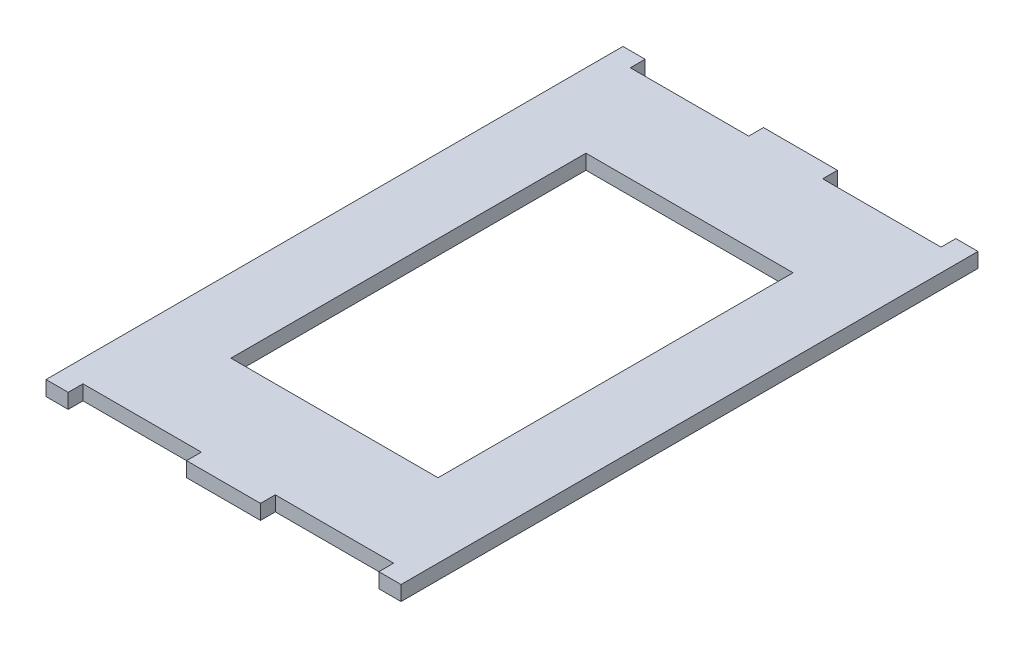
ISO-10303-21;
HEADER;
FILE_DESCRIPTION(('STEP AP214'),'2;1');
FILE_NAME('part.step','',(''),(''),'','','');
FILE_SCHEMA(('AUTOMOTIVE_DESIGN { 1 0 10303 214 1 1 1 1 }'));
ENDSEC;
DATA;
#1=APPLICATION_CONTEXT('core data for automotive mechanical design processes');
#2=APPLICATION_PROTOCOL_DEFINITION('international standard','automotive_design',2000,#1);
#3=PRODUCT_CONTEXT('',#1,'mechanical');
#4=PRODUCT('Part','Part','',(#3));
#5=PRODUCT_RELATED_PRODUCT_CATEGORY('part','',(#4));
#6=PRODUCT_DEFINITION_FORMATION('','',#4);
#7=PRODUCT_DEFINITION_CONTEXT('part definition',#1,'design');
#8=PRODUCT_DEFINITION('design','',#6,#7);
#9=PRODUCT_DEFINITION_SHAPE('','',#8);
#10=(LENGTH_UNIT() NAMED_UNIT(*) SI_UNIT(.MILLI.,.METRE.));
#11=(NAMED_UNIT(*) PLANE_ANGLE_UNIT() SI_UNIT($,.RADIAN.));
#12=(NAMED_UNIT(*) SI_UNIT($,.STERADIAN.) SOLID_ANGLE_UNIT());
#13=UNCERTAINTY_MEASURE_WITH_UNIT(LENGTH_MEASURE(1.E-05),#10,'distance_accuracy_value','');
#14=(GEOMETRIC_REPRESENTATION_CONTEXT(3) GLOBAL_UNCERTAINTY_ASSIGNED_CONTEXT((#13)) GLOBAL_UNIT_ASSIGNED_CONTEXT((#10,
#11,#12)) REPRESENTATION_CONTEXT('',''));
#15=CARTESIAN_POINT('',(0.,0.,0.));
#16=DIRECTION('',(0.,0.,1.));
#17=DIRECTION('',(1.,0.,0.));
#18=AXIS2_PLACEMENT_3D('',#15,#16,#17);
#19=CARTESIAN_POINT('',(0.,10.,0.));
#20=DIRECTION('',(0.,-1.,0.));
#21=DIRECTION('',(0.,0.,-1.));
#22=AXIS2_PLACEMENT_3D('',#19,#20,#21);
#23=PLANE('',#22);
#24=DIRECTION('',(0.,0.,1.));
#25=VECTOR('',#24,1.);
#26=CARTESIAN_POINT('',(0.,10.,-9.99999999999997));
#27=LINE('',#26,#25);
#28=CARTESIAN_POINT('',(0.,10.,-390.));
#29=VERTEX_POINT('',#28);
#30=CARTESIAN_POINT('',(0.,10.,0.));
#31=VERTEX_POINT('',#30);
#32=EDGE_CURVE('E230',#29,#31,#27,.T.);
#33=ORIENTED_EDGE('',*,*,#32,.T.);
#34=DIRECTION('',(1.,0.,0.));
#35=VECTOR('',#34,1.);
#36=CARTESIAN_POINT('',(15.,10.,0.));
#37=LINE('',#36,#35);
#38=CARTESIAN_POINT('',(15.,10.,0.));
#39=VERTEX_POINT('',#38);
#40=EDGE_CURVE('E233',#31,#39,#37,.T.);
#41=ORIENTED_EDGE('',*,*,#40,.T.);
#42=DIRECTION('',(0.,0.,-1.));
#43=VECTOR('',#42,1.);
#44=CARTESIAN_POINT('',(15.,10.,-10.));
#45=LINE('',#44,#43);
#46=CARTESIAN_POINT('',(15.,10.,-10.));
#47=VERTEX_POINT('',#46);
#48=EDGE_CURVE('E236',#39,#47,#45,.T.);
#49=ORIENTED_EDGE('',*,*,#48,.T.);
#50=DIRECTION('',(1.,0.,0.));
#51=VECTOR('',#50,1.);
#52=CARTESIAN_POINT('',(95.,10.,-10.));
#53=LINE('',#52,#51);
#54=CARTESIAN_POINT('',(95.,10.,-10.));
#55=VERTEX_POINT('',#54);
#56=EDGE_CURVE('E238',#47,#55,#53,.T.);
#57=ORIENTED_EDGE('',*,*,#56,.T.);
#58=DIRECTION('',(0.,0.,1.));
#59=VECTOR('',#58,1.);
#60=CARTESIAN_POINT('',(95.,10.,0.));
#61=LINE('',#60,#59);
#62=CARTESIAN_POINT('',(95.,10.,0.));
#63=VERTEX_POINT('',#62);
#64=EDGE_CURVE('E240',#55,#63,#61,.T.);
#65=ORIENTED_EDGE('',*,*,#64,.T.);
#66=DIRECTION('',(1.,0.,0.));
#67=VECTOR('',#66,1.);
#68=CARTESIAN_POINT('',(145.,10.,0.));
#69=LINE('',#68,#67);
#70=CARTESIAN_POINT('',(145.,10.,0.));
#71=VERTEX_POINT('',#70);
#72=EDGE_CURVE('E242',#63,#71,#69,.T.);
#73=ORIENTED_EDGE('',*,*,#72,.T.);
#74=DIRECTION('',(0.,0.,-1.));
#75=VECTOR('',#74,1.);
#76=CARTESIAN_POINT('',(145.,10.,-10.));
#77=LINE('',#76,#75);
#78=CARTESIAN_POINT('',(145.,10.,-10.));
#79=VERTEX_POINT('',#78);
#80=EDGE_CURVE('E244',#71,#79,#77,.T.);
#81=ORIENTED_EDGE('',*,*,#80,.T.);
#82=DIRECTION('',(1.,0.,0.));
#83=VECTOR('',#82,1.);
#84=CARTESIAN_POINT('',(225.,10.,-9.99999999999999));
#85=LINE('',#84,#83);
#86=CARTESIAN_POINT('',(225.,10.,-9.99999999999999));
#87=VERTEX_POINT('',#86);
#88=EDGE_CURVE('E246',#79,#87,#85,.T.);
#89=ORIENTED_EDGE('',*,*,#88,.T.);
#90=DIRECTION('',(0.,0.,1.));
#91=VECTOR('',#90,1.);
#92=CARTESIAN_POINT('',(225.,10.,0.));
#93=LINE('',#92,#91);
#94=CARTESIAN_POINT('',(225.,10.,0.));
#95=VERTEX_POINT('',#94);
#96=EDGE_CURVE('E248',#87,#95,#93,.T.);
#97=ORIENTED_EDGE('',*,*,#96,.T.);
#98=DIRECTION('',(1.,0.,0.));
#99=VECTOR('',#98,1.);
#100=CARTESIAN_POINT('',(240.,10.,0.));
#101=LINE('',#100,#99);
#102=CARTESIAN_POINT('',(240.,10.,0.));
#103=VERTEX_POINT('',#102);
#104=EDGE_CURVE('E250',#95,#103,#101,.T.);
#105=ORIENTED_EDGE('',*,*,#104,.T.);
#106=DIRECTION('',(0.,0.,-1.));
#107=VECTOR('',#106,1.);
#108=CARTESIAN_POINT('',(240.,10.,-9.99999999999994));
#109=LINE('',#108,#107);
#110=CARTESIAN_POINT('',(240.,10.,-390.));
#111=VERTEX_POINT('',#110);
#112=EDGE_CURVE('E252',#103,#111,#109,.T.);
#113=ORIENTED_EDGE('',*,*,#112,.T.);
#114=DIRECTION('',(-1.,0.,0.));
#115=VECTOR('',#114,1.);
#116=CARTESIAN_POINT('',(225.,10.,-390.));
#117=LINE('',#116,#115);
#118=CARTESIAN_POINT('',(225.,10.,-390.));
#119=VERTEX_POINT('',#118);
#120=EDGE_CURVE('E254',#111,#119,#117,.T.);
#121=ORIENTED_EDGE('',*,*,#120,.T.);
#122=DIRECTION('',(0.,0.,1.));
#123=VECTOR('',#122,1.);
#124=CARTESIAN_POINT('',(225.,10.,-390.));
#125=LINE('',#124,#123);
#126=CARTESIAN_POINT('',(225.,10.,-380.));
#127=VERTEX_POINT('',#126);
#128=EDGE_CURVE('E256',#119,#127,#125,.T.);
#129=ORIENTED_EDGE('',*,*,#128,.T.);
#130=DIRECTION('',(-1.,0.,0.));
#131=VECTOR('',#130,1.);
#132=CARTESIAN_POINT('',(145.,10.,-380.));
#133=LINE('',#132,#131);
#134=CARTESIAN_POINT('',(145.,10.,-380.));
#135=VERTEX_POINT('',#134);
#136=EDGE_CURVE('E258',#127,#135,#133,.T.);
#137=ORIENTED_EDGE('',*,*,#136,.T.);
#138=DIRECTION('',(0.,0.,-1.));
#139=VECTOR('',#138,1.);
#140=CARTESIAN_POINT('',(145.,10.,-380.));
#141=LINE('',#140,#139);
#142=CARTESIAN_POINT('',(145.,10.,-390.));
#143=VERTEX_POINT('',#142);
#144=EDGE_CURVE('E260',#135,#143,#141,.T.);
#145=ORIENTED_EDGE('',*,*,#144,.T.);
#146=DIRECTION('',(-1.,0.,0.));
#147=VECTOR('',#146,1.);
#148=CARTESIAN_POINT('',(94.9999999999999,10.,-390.));
#149=LINE('',#148,#147);
#150=CARTESIAN_POINT('',(94.9999999999999,10.,-390.));
#151=VERTEX_POINT('',#150);
#152=EDGE_CURVE('E262',#143,#151,#149,.T.);
#153=ORIENTED_EDGE('',*,*,#152,.T.);
#154=DIRECTION('',(0.,0.,1.));
#155=VECTOR('',#154,1.);
#156=CARTESIAN_POINT('',(94.9999999999999,10.,-390.));
#157=LINE('',#156,#155);
#158=CARTESIAN_POINT('',(94.9999999999999,10.,-380.));
#159=VERTEX_POINT('',#158);
#160=EDGE_CURVE('E264',#151,#159,#157,.T.);
#161=ORIENTED_EDGE('',*,*,#160,.T.);
#162=DIRECTION('',(-1.,0.,0.));
#163=VECTOR('',#162,1.);
#164=CARTESIAN_POINT('',(15.,10.,-380.));
#165=LINE('',#164,#163);
#166=CARTESIAN_POINT('',(15.,10.,-380.));
#167=VERTEX_POINT('',#166);
#168=EDGE_CURVE('E266',#159,#167,#165,.T.);
#169=ORIENTED_EDGE('',*,*,#168,.T.);
#170=DIRECTION('',(0.,0.,-1.));
#171=VECTOR('',#170,1.);
#172=CARTESIAN_POINT('',(15.,10.,-380.));
#173=LINE('',#172,#171);
#174=CARTESIAN_POINT('',(15.,10.,-390.));
#175=VERTEX_POINT('',#174);
#176=EDGE_CURVE('E268',#167,#175,#173,.T.);
#177=ORIENTED_EDGE('',*,*,#176,.T.);
#178=DIRECTION('',(-1.,0.,0.));
#179=VECTOR('',#178,1.);
#180=CARTESIAN_POINT('',(0.,10.,-390.));
#181=LINE('',#180,#179);
#182=EDGE_CURVE('E270',#175,#29,#181,.T.);
#183=ORIENTED_EDGE('',*,*,#182,.T.);
#184=EDGE_LOOP('',(#33,#41,#49,#57,#65,#73,#81,#89,#97,#105,#113,#121,#129,#137,#145,#153,#161,
#169,#177,#183));
#185=FACE_BOUND('',#184,.T.);
#186=DIRECTION('',(0.,0.,1.));
#187=VECTOR('',#186,1.);
#188=CARTESIAN_POINT('',(50.,10.,-315.));
#189=LINE('',#188,#187);
#190=CARTESIAN_POINT('',(50.,10.,-315.));
#191=VERTEX_POINT('',#190);
#192=CARTESIAN_POINT('',(50.,10.,-75.));
#193=VERTEX_POINT('',#192);
#194=EDGE_CURVE('E194',#191,#193,#189,.T.);
#195=ORIENTED_EDGE('',*,*,#194,.F.);
#196=DIRECTION('',(-1.,0.,0.));
#197=VECTOR('',#196,1.);
#198=CARTESIAN_POINT('',(50.,10.,-315.));
#199=LINE('',#198,#197);
#200=CARTESIAN_POINT('',(190.,10.,-315.));
#201=VERTEX_POINT('',#200);
#202=EDGE_CURVE('E216',#201,#191,#199,.T.);
#203=ORIENTED_EDGE('',*,*,#202,.F.);
#204=DIRECTION('',(0.,0.,-1.));
#205=VECTOR('',#204,1.);
#206=CARTESIAN_POINT('',(190.,10.,-315.));
#207=LINE('',#206,#205);
#208=CARTESIAN_POINT('',(190.,10.,-75.));
#209=VERTEX_POINT('',#208);
#210=EDGE_CURVE('E214',#209,#201,#207,.T.);
#211=ORIENTED_EDGE('',*,*,#210,.F.);
#212=DIRECTION('',(1.,0.,0.));
#213=VECTOR('',#212,1.);
#214=CARTESIAN_POINT('',(50.,10.,-75.));
#215=LINE('',#214,#213);
#216=EDGE_CURVE('E202',#193,#209,#215,.T.);
#217=ORIENTED_EDGE('',*,*,#216,.F.);
#218=EDGE_LOOP('',(#195,#203,#211,#217));
#219=FACE_BOUND('',#218,.T.);
#220=ADVANCED_FACE('F33',(#185,#219),#23,.F.);
#221=CARTESIAN_POINT('',(0.,0.,0.));
#222=DIRECTION('',(0.,-1.,0.));
#223=DIRECTION('',(0.,0.,-1.));
#224=AXIS2_PLACEMENT_3D('',#221,#222,#223);
#225=PLANE('',#224);
#226=DIRECTION('',(1.,0.,0.));
#227=VECTOR('',#226,1.);
#228=CARTESIAN_POINT('',(15.,0.,0.));
#229=LINE('',#228,#227);
#230=CARTESIAN_POINT('',(0.,0.,0.));
#231=VERTEX_POINT('',#230);
#232=CARTESIAN_POINT('',(15.,0.,0.));
#233=VERTEX_POINT('',#232);
#234=EDGE_CURVE('E210',#231,#233,#229,.T.);
#235=ORIENTED_EDGE('',*,*,#234,.F.);
#236=DIRECTION('',(0.,0.,1.));
#237=VECTOR('',#236,1.);
#238=CARTESIAN_POINT('',(0.,0.,-9.99999999999997));
#239=LINE('',#238,#237);
#240=CARTESIAN_POINT('',(0.,0.,-390.));
#241=VERTEX_POINT('',#240);
#242=EDGE_CURVE('E234',#241,#231,#239,.T.);
#243=ORIENTED_EDGE('',*,*,#242,.F.);
#244=DIRECTION('',(-1.,0.,0.));
#245=VECTOR('',#244,1.);
#246=CARTESIAN_POINT('',(0.,0.,-390.));
#247=LINE('',#246,#245);
#248=CARTESIAN_POINT('',(15.,0.,-390.));
#249=VERTEX_POINT('',#248);
#250=EDGE_CURVE('E310',#249,#241,#247,.T.);
#251=ORIENTED_EDGE('',*,*,#250,.F.);
#252=DIRECTION('',(0.,0.,-1.));
#253=VECTOR('',#252,1.);
#254=CARTESIAN_POINT('',(15.,0.,-380.));
#255=LINE('',#254,#253);
#256=CARTESIAN_POINT('',(15.,0.,-380.));
#257=VERTEX_POINT('',#256);
#258=EDGE_CURVE('E308',#257,#249,#255,.T.);
#259=ORIENTED_EDGE('',*,*,#258,.F.);
#260=DIRECTION('',(-1.,0.,0.));
#261=VECTOR('',#260,1.);
#262=CARTESIAN_POINT('',(15.,0.,-380.));
#263=LINE('',#262,#261);
#264=CARTESIAN_POINT('',(94.9999999999999,0.,-380.));
#265=VERTEX_POINT('',#264);
#266=EDGE_CURVE('E306',#265,#257,#263,.T.);
#267=ORIENTED_EDGE('',*,*,#266,.F.);
#268=DIRECTION('',(0.,0.,1.));
#269=VECTOR('',#268,1.);
#270=CARTESIAN_POINT('',(94.9999999999999,0.,-390.));
#271=LINE('',#270,#269);
#272=CARTESIAN_POINT('',(94.9999999999999,0.,-390.));
#273=VERTEX_POINT('',#272);
#274=EDGE_CURVE('E304',#273,#265,#271,.T.);
#275=ORIENTED_EDGE('',*,*,#274,.F.);
#276=DIRECTION('',(-1.,0.,0.));
#277=VECTOR('',#276,1.);
#278=CARTESIAN_POINT('',(94.9999999999999,0.,-390.));
#279=LINE('',#278,#277);
#280=CARTESIAN_POINT('',(145.,0.,-390.));
#281=VERTEX_POINT('',#280);
#282=EDGE_CURVE('E302',#281,#273,#279,.T.);
#283=ORIENTED_EDGE('',*,*,#282,.F.);
#284=DIRECTION('',(0.,0.,-1.));
#285=VECTOR('',#284,1.);
#286=CARTESIAN_POINT('',(145.,0.,-380.));
#287=LINE('',#286,#285);
#288=CARTESIAN_POINT('',(145.,0.,-380.));
#289=VERTEX_POINT('',#288);
#290=EDGE_CURVE('E300',#289,#281,#287,.T.);
#291=ORIENTED_EDGE('',*,*,#290,.F.);
#292=DIRECTION('',(-1.,0.,0.));
#293=VECTOR('',#292,1.);
#294=CARTESIAN_POINT('',(145.,0.,-380.));
#295=LINE('',#294,#293);
#296=CARTESIAN_POINT('',(225.,0.,-380.));
#297=VERTEX_POINT('',#296);
#298=EDGE_CURVE('E298',#297,#289,#295,.T.);
#299=ORIENTED_EDGE('',*,*,#298,.F.);
#300=DIRECTION('',(0.,0.,1.));
#301=VECTOR('',#300,1.);
#302=CARTESIAN_POINT('',(225.,0.,-390.));
#303=LINE('',#302,#301);
#304=CARTESIAN_POINT('',(225.,0.,-390.));
#305=VERTEX_POINT('',#304);
#306=EDGE_CURVE('E296',#305,#297,#303,.T.);
#307=ORIENTED_EDGE('',*,*,#306,.F.);
#308=DIRECTION('',(-1.,0.,0.));
#309=VECTOR('',#308,1.);
#310=CARTESIAN_POINT('',(225.,0.,-390.));
#311=LINE('',#310,#309);
#312=CARTESIAN_POINT('',(240.,0.,-390.));
#313=VERTEX_POINT('',#312);
#314=EDGE_CURVE('E294',#313,#305,#311,.T.);
#315=ORIENTED_EDGE('',*,*,#314,.F.);
#316=DIRECTION('',(0.,0.,-1.));
#317=VECTOR('',#316,1.);
#318=CARTESIAN_POINT('',(240.,0.,-390.));
#319=LINE('',#318,#317);
#320=CARTESIAN_POINT('',(240.,0.,0.));
#321=VERTEX_POINT('',#320);
#322=EDGE_CURVE('E292',#321,#313,#319,.T.);
#323=ORIENTED_EDGE('',*,*,#322,.F.);
#324=DIRECTION('',(1.,0.,0.));
#325=VECTOR('',#324,1.);
#326=CARTESIAN_POINT('',(240.,0.,0.));
#327=LINE('',#326,#325);
#328=CARTESIAN_POINT('',(225.,0.,0.));
#329=VERTEX_POINT('',#328);
#330=EDGE_CURVE('E289',#329,#321,#327,.T.);
#331=ORIENTED_EDGE('',*,*,#330,.F.);
#332=DIRECTION('',(0.,0.,1.));
#333=VECTOR('',#332,1.);
#334=CARTESIAN_POINT('',(225.,0.,0.));
#335=LINE('',#334,#333);
#336=CARTESIAN_POINT('',(225.,0.,-9.99999999999999));
#337=VERTEX_POINT('',#336);
#338=EDGE_CURVE('E287',#337,#329,#335,.T.);
#339=ORIENTED_EDGE('',*,*,#338,.F.);
#340=DIRECTION('',(1.,0.,0.));
#341=VECTOR('',#340,1.);
#342=CARTESIAN_POINT('',(225.,0.,-9.99999999999999));
#343=LINE('',#342,#341);
#344=CARTESIAN_POINT('',(145.,0.,-10.));
#345=VERTEX_POINT('',#344);
#346=EDGE_CURVE('E285',#345,#337,#343,.T.);
#347=ORIENTED_EDGE('',*,*,#346,.F.);
#348=DIRECTION('',(0.,0.,-1.));
#349=VECTOR('',#348,1.);
#350=CARTESIAN_POINT('',(145.,0.,-10.));
#351=LINE('',#350,#349);
#352=CARTESIAN_POINT('',(145.,0.,0.));
#353=VERTEX_POINT('',#352);
#354=EDGE_CURVE('E283',#353,#345,#351,.T.);
#355=ORIENTED_EDGE('',*,*,#354,.F.);
#356=DIRECTION('',(1.,0.,0.));
#357=VECTOR('',#356,1.);
#358=CARTESIAN_POINT('',(145.,0.,0.));
#359=LINE('',#358,#357);
#360=CARTESIAN_POINT('',(95.,0.,0.));
#361=VERTEX_POINT('',#360);
#362=EDGE_CURVE('E281',#361,#353,#359,.T.);
#363=ORIENTED_EDGE('',*,*,#362,.F.);
#364=DIRECTION('',(0.,0.,1.));
#365=VECTOR('',#364,1.);
#366=CARTESIAN_POINT('',(95.,0.,0.));
#367=LINE('',#366,#365);
#368=CARTESIAN_POINT('',(95.,0.,-10.));
#369=VERTEX_POINT('',#368);
#370=EDGE_CURVE('E279',#369,#361,#367,.T.);
#371=ORIENTED_EDGE('',*,*,#370,.F.);
#372=DIRECTION('',(1.,0.,0.));
#373=VECTOR('',#372,1.);
#374=CARTESIAN_POINT('',(95.,0.,-10.));
#375=LINE('',#374,#373);
#376=CARTESIAN_POINT('',(15.,0.,-10.));
#377=VERTEX_POINT('',#376);
#378=EDGE_CURVE('E277',#377,#369,#375,.T.);
#379=ORIENTED_EDGE('',*,*,#378,.F.);
#380=DIRECTION('',(0.,0.,-1.));
#381=VECTOR('',#380,1.);
#382=CARTESIAN_POINT('',(15.,0.,-10.));
#383=LINE('',#382,#381);
#384=EDGE_CURVE('E275',#233,#377,#383,.T.);
#385=ORIENTED_EDGE('',*,*,#384,.F.);
#386=EDGE_LOOP('',(#235,#243,#251,#259,#267,#275,#283,#291,#299,#307,#315,#323,#331,#339,#347,
#355,#363,#371,#379,#385));
#387=FACE_BOUND('',#386,.T.);
#388=DIRECTION('',(-1.,0.,0.));
#389=VECTOR('',#388,1.);
#390=CARTESIAN_POINT('',(50.,0.,-315.));
#391=LINE('',#390,#389);
#392=CARTESIAN_POINT('',(190.,0.,-315.));
#393=VERTEX_POINT('',#392);
#394=CARTESIAN_POINT('',(50.,0.,-315.));
#395=VERTEX_POINT('',#394);
#396=EDGE_CURVE('E203',#393,#395,#391,.T.);
#397=ORIENTED_EDGE('',*,*,#396,.T.);
#398=DIRECTION('',(0.,0.,1.));
#399=VECTOR('',#398,1.);
#400=CARTESIAN_POINT('',(50.,0.,-315.));
#401=LINE('',#400,#399);
#402=CARTESIAN_POINT('',(50.,0.,-75.));
#403=VERTEX_POINT('',#402);
#404=EDGE_CURVE('E56',#395,#403,#401,.T.);
#405=ORIENTED_EDGE('',*,*,#404,.T.);
#406=DIRECTION('',(1.,0.,0.));
#407=VECTOR('',#406,1.);
#408=CARTESIAN_POINT('',(50.,0.,-75.));
#409=LINE('',#408,#407);
#410=CARTESIAN_POINT('',(190.,0.,-75.));
#411=VERTEX_POINT('',#410);
#412=EDGE_CURVE('E209',#403,#411,#409,.T.);
#413=ORIENTED_EDGE('',*,*,#412,.T.);
#414=DIRECTION('',(0.,0.,-1.));
#415=VECTOR('',#414,1.);
#416=CARTESIAN_POINT('',(190.,0.,-315.));
#417=LINE('',#416,#415);
#418=EDGE_CURVE('E222',#411,#393,#417,.T.);
#419=ORIENTED_EDGE('',*,*,#418,.T.);
#420=EDGE_LOOP('',(#397,#405,#413,#419));
#421=FACE_BOUND('',#420,.T.);
#422=ADVANCED_FACE('F377',(#387,#421),#225,.T.);
#423=CARTESIAN_POINT('',(15.,10.,0.));
#424=DIRECTION('',(0.,0.,-1.));
#425=DIRECTION('',(-1.,0.,0.));
#426=AXIS2_PLACEMENT_3D('',#423,#424,#425);
#427=PLANE('',#426);
#428=ORIENTED_EDGE('',*,*,#234,.T.);
#429=DIRECTION('',(0.,-1.,0.));
#430=VECTOR('',#429,1.);
#431=CARTESIAN_POINT('',(15.,10.,0.));
#432=LINE('',#431,#430);
#433=EDGE_CURVE('E41',#39,#233,#432,.T.);
#434=ORIENTED_EDGE('',*,*,#433,.F.);
#435=ORIENTED_EDGE('',*,*,#40,.F.);
#436=DIRECTION('',(0.,-1.,0.));
#437=VECTOR('',#436,1.);
#438=CARTESIAN_POINT('',(0.,10.,0.));
#439=LINE('',#438,#437);
#440=EDGE_CURVE('E11',#31,#231,#439,.T.);
#441=ORIENTED_EDGE('',*,*,#440,.T.);
#442=EDGE_LOOP('',(#428,#434,#435,#441));
#443=FACE_BOUND('',#442,.T.);
#444=ADVANCED_FACE('F35',(#443),#427,.F.);
#445=CARTESIAN_POINT('',(15.,10.,-10.));
#446=DIRECTION('',(-1.,0.,0.));
#447=DIRECTION('',(0.,0.,1.));
#448=AXIS2_PLACEMENT_3D('',#445,#446,#447);
#449=PLANE('',#448);
#450=ORIENTED_EDGE('',*,*,#384,.T.);
#451=DIRECTION('',(0.,-1.,0.));
#452=VECTOR('',#451,1.);
#453=CARTESIAN_POINT('',(15.,10.,-10.));
#454=LINE('',#453,#452);
#455=EDGE_CURVE('E364',#47,#377,#454,.T.);
#456=ORIENTED_EDGE('',*,*,#455,.F.);
#457=ORIENTED_EDGE('',*,*,#48,.F.);
#458=ORIENTED_EDGE('',*,*,#433,.T.);
#459=EDGE_LOOP('',(#450,#456,#457,#458));
#460=FACE_BOUND('',#459,.T.);
#461=ADVANCED_FACE('F371',(#460),#449,.F.);
#462=CARTESIAN_POINT('',(95.,10.,-10.));
#463=DIRECTION('',(0.,0.,-1.));
#464=DIRECTION('',(-1.,0.,0.));
#465=AXIS2_PLACEMENT_3D('',#462,#463,#464);
#466=PLANE('',#465);
#467=ORIENTED_EDGE('',*,*,#378,.T.);
#468=DIRECTION('',(0.,-1.,0.));
#469=VECTOR('',#468,1.);
#470=CARTESIAN_POINT('',(95.,10.,-10.));
#471=LINE('',#470,#469);
#472=EDGE_CURVE('E361',#55,#369,#471,.T.);
#473=ORIENTED_EDGE('',*,*,#472,.F.);
#474=ORIENTED_EDGE('',*,*,#56,.F.);
#475=ORIENTED_EDGE('',*,*,#455,.T.);
#476=EDGE_LOOP('',(#467,#473,#474,#475));
#477=FACE_BOUND('',#476,.T.);
#478=ADVANCED_FACE('F383',(#477),#466,.F.);
#479=CARTESIAN_POINT('',(95.,10.,0.));
#480=DIRECTION('',(1.,0.,0.));
#481=DIRECTION('',(0.,0.,-1.));
#482=AXIS2_PLACEMENT_3D('',#479,#480,#481);
#483=PLANE('',#482);
#484=ORIENTED_EDGE('',*,*,#370,.T.);
#485=DIRECTION('',(0.,-1.,0.));
#486=VECTOR('',#485,1.);
#487=CARTESIAN_POINT('',(95.,10.,0.));
#488=LINE('',#487,#486);
#489=EDGE_CURVE('E358',#63,#361,#488,.T.);
#490=ORIENTED_EDGE('',*,*,#489,.F.);
#491=ORIENTED_EDGE('',*,*,#64,.F.);
#492=ORIENTED_EDGE('',*,*,#472,.T.);
#493=EDGE_LOOP('',(#484,#490,#491,#492));
#494=FACE_BOUND('',#493,.T.);
#495=ADVANCED_FACE('F387',(#494),#483,.F.);
#496=CARTESIAN_POINT('',(145.,10.,0.));
#497=DIRECTION('',(0.,0.,-1.));
#498=DIRECTION('',(-1.,0.,0.));
#499=AXIS2_PLACEMENT_3D('',#496,#497,#498);
#500=PLANE('',#499);
#501=ORIENTED_EDGE('',*,*,#362,.T.);
#502=DIRECTION('',(0.,-1.,0.));
#503=VECTOR('',#502,1.);
#504=CARTESIAN_POINT('',(145.,10.,0.));
#505=LINE('',#504,#503);
#506=EDGE_CURVE('E355',#71,#353,#505,.T.);
#507=ORIENTED_EDGE('',*,*,#506,.F.);
#508=ORIENTED_EDGE('',*,*,#72,.F.);
#509=ORIENTED_EDGE('',*,*,#489,.T.);
#510=EDGE_LOOP('',(#501,#507,#508,#509));
#511=FACE_BOUND('',#510,.T.);
#512=ADVANCED_FACE('F465',(#511),#500,.F.);
#513=CARTESIAN_POINT('',(145.,10.,-10.));
#514=DIRECTION('',(-1.,0.,0.));
#515=DIRECTION('',(0.,0.,1.));
#516=AXIS2_PLACEMENT_3D('',#513,#514,#515);
#517=PLANE('',#516);
#518=ORIENTED_EDGE('',*,*,#354,.T.);
#519=DIRECTION('',(0.,-1.,0.));
#520=VECTOR('',#519,1.);
#521=CARTESIAN_POINT('',(145.,10.,-10.));
#522=LINE('',#521,#520);
#523=EDGE_CURVE('E352',#79,#345,#522,.T.);
#524=ORIENTED_EDGE('',*,*,#523,.F.);
#525=ORIENTED_EDGE('',*,*,#80,.F.);
#526=ORIENTED_EDGE('',*,*,#506,.T.);
#527=EDGE_LOOP('',(#518,#524,#525,#526));
#528=FACE_BOUND('',#527,.T.);
#529=ADVANCED_FACE('F463',(#528),#517,.F.);
#530=CARTESIAN_POINT('',(225.,10.,-9.99999999999999));
#531=DIRECTION('',(0.,0.,-1.));
#532=DIRECTION('',(-1.,0.,0.));
#533=AXIS2_PLACEMENT_3D('',#530,#531,#532);
#534=PLANE('',#533);
#535=ORIENTED_EDGE('',*,*,#346,.T.);
#536=DIRECTION('',(0.,-1.,0.));
#537=VECTOR('',#536,1.);
#538=CARTESIAN_POINT('',(225.,10.,-9.99999999999999));
#539=LINE('',#538,#537);
#540=EDGE_CURVE('E349',#87,#337,#539,.T.);
#541=ORIENTED_EDGE('',*,*,#540,.F.);
#542=ORIENTED_EDGE('',*,*,#88,.F.);
#543=ORIENTED_EDGE('',*,*,#523,.T.);
#544=EDGE_LOOP('',(#535,#541,#542,#543));
#545=FACE_BOUND('',#544,.T.);
#546=ADVANCED_FACE('F459',(#545),#534,.F.);
#547=CARTESIAN_POINT('',(225.,10.,0.));
#548=DIRECTION('',(1.,0.,0.));
#549=DIRECTION('',(0.,0.,-1.));
#550=AXIS2_PLACEMENT_3D('',#547,#548,#549);
#551=PLANE('',#550);
#552=ORIENTED_EDGE('',*,*,#338,.T.);
#553=DIRECTION('',(0.,-1.,0.));
#554=VECTOR('',#553,1.);
#555=CARTESIAN_POINT('',(225.,10.,0.));
#556=LINE('',#555,#554);
#557=EDGE_CURVE('E346',#95,#329,#556,.T.);
#558=ORIENTED_EDGE('',*,*,#557,.F.);
#559=ORIENTED_EDGE('',*,*,#96,.F.);
#560=ORIENTED_EDGE('',*,*,#540,.T.);
#561=EDGE_LOOP('',(#552,#558,#559,#560));
#562=FACE_BOUND('',#561,.T.);
#563=ADVANCED_FACE('F454',(#562),#551,.F.);
#564=CARTESIAN_POINT('',(240.,10.,0.));
#565=DIRECTION('',(0.,0.,-1.));
#566=DIRECTION('',(-1.,0.,0.));
#567=AXIS2_PLACEMENT_3D('',#564,#565,#566);
#568=PLANE('',#567);
#569=ORIENTED_EDGE('',*,*,#330,.T.);
#570=DIRECTION('',(0.,-1.,0.));
#571=VECTOR('',#570,1.);
#572=CARTESIAN_POINT('',(240.,10.,0.));
#573=LINE('',#572,#571);
#574=EDGE_CURVE('E343',#103,#321,#573,.T.);
#575=ORIENTED_EDGE('',*,*,#574,.F.);
#576=ORIENTED_EDGE('',*,*,#104,.F.);
#577=ORIENTED_EDGE('',*,*,#557,.T.);
#578=EDGE_LOOP('',(#569,#575,#576,#577));
#579=FACE_BOUND('',#578,.T.);
#580=ADVANCED_FACE('F448',(#579),#568,.F.);
#581=CARTESIAN_POINT('',(240.,10.,-390.));
#582=DIRECTION('',(-1.,0.,0.));
#583=DIRECTION('',(0.,0.,1.));
#584=AXIS2_PLACEMENT_3D('',#581,#582,#583);
#585=PLANE('',#584);
#586=ORIENTED_EDGE('',*,*,#322,.T.);
#587=DIRECTION('',(0.,-1.,0.));
#588=VECTOR('',#587,1.);
#589=CARTESIAN_POINT('',(240.,10.,-390.));
#590=LINE('',#589,#588);
#591=EDGE_CURVE('E340',#111,#313,#590,.T.);
#592=ORIENTED_EDGE('',*,*,#591,.F.);
#593=ORIENTED_EDGE('',*,*,#112,.F.);
#594=ORIENTED_EDGE('',*,*,#574,.T.);
#595=EDGE_LOOP('',(#586,#592,#593,#594));
#596=FACE_BOUND('',#595,.T.);
#597=ADVANCED_FACE('F444',(#596),#585,.F.);
#598=CARTESIAN_POINT('',(225.,10.,-390.));
#599=DIRECTION('',(0.,0.,1.));
#600=DIRECTION('',(1.,0.,0.));
#601=AXIS2_PLACEMENT_3D('',#598,#599,#600);
#602=PLANE('',#601);
#603=ORIENTED_EDGE('',*,*,#314,.T.);
#604=DIRECTION('',(0.,-1.,0.));
#605=VECTOR('',#604,1.);
#606=CARTESIAN_POINT('',(225.,10.,-390.));
#607=LINE('',#606,#605);
#608=EDGE_CURVE('E337',#119,#305,#607,.T.);
#609=ORIENTED_EDGE('',*,*,#608,.F.);
#610=ORIENTED_EDGE('',*,*,#120,.F.);
#611=ORIENTED_EDGE('',*,*,#591,.T.);
#612=EDGE_LOOP('',(#603,#609,#610,#611));
#613=FACE_BOUND('',#612,.T.);
#614=ADVANCED_FACE('F439',(#613),#602,.F.);
#615=CARTESIAN_POINT('',(225.,10.,-390.));
#616=DIRECTION('',(1.,0.,0.));
#617=DIRECTION('',(0.,0.,-1.));
#618=AXIS2_PLACEMENT_3D('',#615,#616,#617);
#619=PLANE('',#618);
#620=ORIENTED_EDGE('',*,*,#306,.T.);
#621=DIRECTION('',(0.,-1.,0.));
#622=VECTOR('',#621,1.);
#623=CARTESIAN_POINT('',(225.,10.,-380.));
#624=LINE('',#623,#622);
#625=EDGE_CURVE('E334',#127,#297,#624,.T.);
#626=ORIENTED_EDGE('',*,*,#625,.F.);
#627=ORIENTED_EDGE('',*,*,#128,.F.);
#628=ORIENTED_EDGE('',*,*,#608,.T.);
#629=EDGE_LOOP('',(#620,#626,#627,#628));
#630=FACE_BOUND('',#629,.T.);
#631=ADVANCED_FACE('F434',(#630),#619,.F.);
#632=CARTESIAN_POINT('',(145.,10.,-380.));
#633=DIRECTION('',(0.,0.,1.));
#634=DIRECTION('',(1.,0.,0.));
#635=AXIS2_PLACEMENT_3D('',#632,#633,#634);
#636=PLANE('',#635);
#637=ORIENTED_EDGE('',*,*,#298,.T.);
#638=DIRECTION('',(0.,-1.,0.));
#639=VECTOR('',#638,1.);
#640=CARTESIAN_POINT('',(145.,10.,-380.));
#641=LINE('',#640,#639);
#642=EDGE_CURVE('E331',#135,#289,#641,.T.);
#643=ORIENTED_EDGE('',*,*,#642,.F.);
#644=ORIENTED_EDGE('',*,*,#136,.F.);
#645=ORIENTED_EDGE('',*,*,#625,.T.);
#646=EDGE_LOOP('',(#637,#643,#644,#645));
#647=FACE_BOUND('',#646,.T.);
#648=ADVANCED_FACE('F430',(#647),#636,.F.);
#649=CARTESIAN_POINT('',(145.,10.,-380.));
#650=DIRECTION('',(-1.,0.,0.));
#651=DIRECTION('',(0.,0.,1.));
#652=AXIS2_PLACEMENT_3D('',#649,#650,#651);
#653=PLANE('',#652);
#654=ORIENTED_EDGE('',*,*,#290,.T.);
#655=DIRECTION('',(0.,-1.,0.));
#656=VECTOR('',#655,1.);
#657=CARTESIAN_POINT('',(145.,10.,-390.));
#658=LINE('',#657,#656);
#659=EDGE_CURVE('E328',#143,#281,#658,.T.);
#660=ORIENTED_EDGE('',*,*,#659,.F.);
#661=ORIENTED_EDGE('',*,*,#144,.F.);
#662=ORIENTED_EDGE('',*,*,#642,.T.);
#663=EDGE_LOOP('',(#654,#660,#661,#662));
#664=FACE_BOUND('',#663,.T.);
#665=ADVANCED_FACE('F425',(#664),#653,.F.);
#666=CARTESIAN_POINT('',(94.9999999999999,10.,-390.));
#667=DIRECTION('',(0.,0.,1.));
#668=DIRECTION('',(1.,0.,0.));
#669=AXIS2_PLACEMENT_3D('',#666,#667,#668);
#670=PLANE('',#669);
#671=ORIENTED_EDGE('',*,*,#282,.T.);
#672=DIRECTION('',(0.,-1.,0.));
#673=VECTOR('',#672,1.);
#674=CARTESIAN_POINT('',(94.9999999999999,10.,-390.));
#675=LINE('',#674,#673);
#676=EDGE_CURVE('E325',#151,#273,#675,.T.);
#677=ORIENTED_EDGE('',*,*,#676,.F.);
#678=ORIENTED_EDGE('',*,*,#152,.F.);
#679=ORIENTED_EDGE('',*,*,#659,.T.);
#680=EDGE_LOOP('',(#671,#677,#678,#679));
#681=FACE_BOUND('',#680,.T.);
#682=ADVANCED_FACE('F419',(#681),#670,.F.);
#683=CARTESIAN_POINT('',(94.9999999999999,10.,-390.));
#684=DIRECTION('',(1.,0.,0.));
#685=DIRECTION('',(0.,0.,-1.));
#686=AXIS2_PLACEMENT_3D('',#683,#684,#685);
#687=PLANE('',#686);
#688=ORIENTED_EDGE('',*,*,#274,.T.);
#689=DIRECTION('',(0.,-1.,0.));
#690=VECTOR('',#689,1.);
#691=CARTESIAN_POINT('',(94.9999999999999,10.,-380.));
#692=LINE('',#691,#690);
#693=EDGE_CURVE('E322',#159,#265,#692,.T.);
#694=ORIENTED_EDGE('',*,*,#693,.F.);
#695=ORIENTED_EDGE('',*,*,#160,.F.);
#696=ORIENTED_EDGE('',*,*,#676,.T.);
#697=EDGE_LOOP('',(#688,#694,#695,#696));
#698=FACE_BOUND('',#697,.T.);
#699=ADVANCED_FACE('F415',(#698),#687,.F.);
#700=CARTESIAN_POINT('',(15.,10.,-380.));
#701=DIRECTION('',(0.,0.,1.));
#702=DIRECTION('',(1.,0.,0.));
#703=AXIS2_PLACEMENT_3D('',#700,#701,#702);
#704=PLANE('',#703);
#705=ORIENTED_EDGE('',*,*,#266,.T.);
#706=DIRECTION('',(0.,-1.,0.));
#707=VECTOR('',#706,1.);
#708=CARTESIAN_POINT('',(15.,10.,-380.));
#709=LINE('',#708,#707);
#710=EDGE_CURVE('E319',#167,#257,#709,.T.);
#711=ORIENTED_EDGE('',*,*,#710,.F.);
#712=ORIENTED_EDGE('',*,*,#168,.F.);
#713=ORIENTED_EDGE('',*,*,#693,.T.);
#714=EDGE_LOOP('',(#705,#711,#712,#713));
#715=FACE_BOUND('',#714,.T.);
#716=ADVANCED_FACE('F410',(#715),#704,.F.);
#717=CARTESIAN_POINT('',(15.,10.,-380.));
#718=DIRECTION('',(-1.,0.,0.));
#719=DIRECTION('',(0.,0.,1.));
#720=AXIS2_PLACEMENT_3D('',#717,#718,#719);
#721=PLANE('',#720);
#722=ORIENTED_EDGE('',*,*,#258,.T.);
#723=DIRECTION('',(0.,-1.,0.));
#724=VECTOR('',#723,1.);
#725=CARTESIAN_POINT('',(15.,10.,-390.));
#726=LINE('',#725,#724);
#727=EDGE_CURVE('E316',#175,#249,#726,.T.);
#728=ORIENTED_EDGE('',*,*,#727,.F.);
#729=ORIENTED_EDGE('',*,*,#176,.F.);
#730=ORIENTED_EDGE('',*,*,#710,.T.);
#731=EDGE_LOOP('',(#722,#728,#729,#730));
#732=FACE_BOUND('',#731,.T.);
#733=ADVANCED_FACE('F404',(#732),#721,.F.);
#734=CARTESIAN_POINT('',(0.,10.,-390.));
#735=DIRECTION('',(0.,0.,1.));
#736=DIRECTION('',(1.,0.,0.));
#737=AXIS2_PLACEMENT_3D('',#734,#735,#736);
#738=PLANE('',#737);
#739=ORIENTED_EDGE('',*,*,#250,.T.);
#740=DIRECTION('',(0.,-1.,0.));
#741=VECTOR('',#740,1.);
#742=CARTESIAN_POINT('',(0.,10.,-390.));
#743=LINE('',#742,#741);
#744=EDGE_CURVE('E273',#29,#241,#743,.T.);
#745=ORIENTED_EDGE('',*,*,#744,.F.);
#746=ORIENTED_EDGE('',*,*,#182,.F.);
#747=ORIENTED_EDGE('',*,*,#727,.T.);
#748=EDGE_LOOP('',(#739,#745,#746,#747));
#749=FACE_BOUND('',#748,.T.);
#750=ADVANCED_FACE('F399',(#749),#738,.F.);
#751=CARTESIAN_POINT('',(0.,10.,-9.99999999999997));
#752=DIRECTION('',(1.,0.,0.));
#753=DIRECTION('',(0.,0.,-1.));
#754=AXIS2_PLACEMENT_3D('',#751,#752,#753);
#755=PLANE('',#754);
#756=ORIENTED_EDGE('',*,*,#242,.T.);
#757=ORIENTED_EDGE('',*,*,#440,.F.);
#758=ORIENTED_EDGE('',*,*,#32,.F.);
#759=ORIENTED_EDGE('',*,*,#744,.T.);
#760=EDGE_LOOP('',(#756,#757,#758,#759));
#761=FACE_BOUND('',#760,.T.);
#762=ADVANCED_FACE('F394',(#761),#755,.F.);
#763=CARTESIAN_POINT('',(50.,10.,-315.));
#764=DIRECTION('',(1.,0.,0.));
#765=DIRECTION('',(0.,0.,-1.));
#766=AXIS2_PLACEMENT_3D('',#763,#764,#765);
#767=PLANE('',#766);
#768=ORIENTED_EDGE('',*,*,#404,.F.);
#769=DIRECTION('',(0.,-1.,0.));
#770=VECTOR('',#769,1.);
#771=CARTESIAN_POINT('',(50.,10.,-315.));
#772=LINE('',#771,#770);
#773=EDGE_CURVE('E198',#191,#395,#772,.T.);
#774=ORIENTED_EDGE('',*,*,#773,.F.);
#775=ORIENTED_EDGE('',*,*,#194,.T.);
#776=DIRECTION('',(0.,-1.,0.));
#777=VECTOR('',#776,1.);
#778=CARTESIAN_POINT('',(50.,10.,-75.));
#779=LINE('',#778,#777);
#780=EDGE_CURVE('E197',#193,#403,#779,.T.);
#781=ORIENTED_EDGE('',*,*,#780,.T.);
#782=EDGE_LOOP('',(#768,#774,#775,#781));
#783=FACE_BOUND('',#782,.T.);
#784=ADVANCED_FACE('F196',(#783),#767,.T.);
#785=CARTESIAN_POINT('',(50.,10.,-75.));
#786=DIRECTION('',(0.,0.,-1.));
#787=DIRECTION('',(-1.,0.,0.));
#788=AXIS2_PLACEMENT_3D('',#785,#786,#787);
#789=PLANE('',#788);
#790=ORIENTED_EDGE('',*,*,#412,.F.);
#791=ORIENTED_EDGE('',*,*,#780,.F.);
#792=ORIENTED_EDGE('',*,*,#216,.T.);
#793=DIRECTION('',(0.,-1.,0.));
#794=VECTOR('',#793,1.);
#795=CARTESIAN_POINT('',(190.,10.,-75.));
#796=LINE('',#795,#794);
#797=EDGE_CURVE('E211',#209,#411,#796,.T.);
#798=ORIENTED_EDGE('',*,*,#797,.T.);
#799=EDGE_LOOP('',(#790,#791,#792,#798));
#800=FACE_BOUND('',#799,.T.);
#801=ADVANCED_FACE('F206',(#800),#789,.T.);
#802=CARTESIAN_POINT('',(190.,10.,-315.));
#803=DIRECTION('',(-1.,0.,0.));
#804=DIRECTION('',(0.,0.,1.));
#805=AXIS2_PLACEMENT_3D('',#802,#803,#804);
#806=PLANE('',#805);
#807=ORIENTED_EDGE('',*,*,#418,.F.);
#808=ORIENTED_EDGE('',*,*,#797,.F.);
#809=ORIENTED_EDGE('',*,*,#210,.T.);
#810=DIRECTION('',(0.,-1.,0.));
#811=VECTOR('',#810,1.);
#812=CARTESIAN_POINT('',(190.,10.,-315.));
#813=LINE('',#812,#811);
#814=EDGE_CURVE('E48',#201,#393,#813,.T.);
#815=ORIENTED_EDGE('',*,*,#814,.T.);
#816=EDGE_LOOP('',(#807,#808,#809,#815));
#817=FACE_BOUND('',#816,.T.);
#818=ADVANCED_FACE('F577',(#817),#806,.T.);
#819=CARTESIAN_POINT('',(50.,10.,-315.));
#820=DIRECTION('',(0.,0.,1.));
#821=DIRECTION('',(1.,0.,0.));
#822=AXIS2_PLACEMENT_3D('',#819,#820,#821);
#823=PLANE('',#822);
#824=ORIENTED_EDGE('',*,*,#396,.F.);
#825=ORIENTED_EDGE('',*,*,#814,.F.);
#826=ORIENTED_EDGE('',*,*,#202,.T.);
#827=ORIENTED_EDGE('',*,*,#773,.T.);
#828=EDGE_LOOP('',(#824,#825,#826,#827));
#829=FACE_BOUND('',#828,.T.);
#830=ADVANCED_FACE('F583',(#829),#823,.T.);
#831=CLOSED_SHELL('',(#220,#422,#444,#461,#478,#495,#512,#529,#546,#563,#580,#597,#614,#631,
#648,#665,#682,#699,#716,#733,#750,#762,#784,#801,#818,#830));
#832=MANIFOLD_SOLID_BREP('B2',#831);
#833=ADVANCED_BREP_SHAPE_REPRESENTATION('',(#18,#832),#14);
#834=SHAPE_DEFINITION_REPRESENTATION(#9,#833);
ENDSEC;
END-ISO-10303-21;
